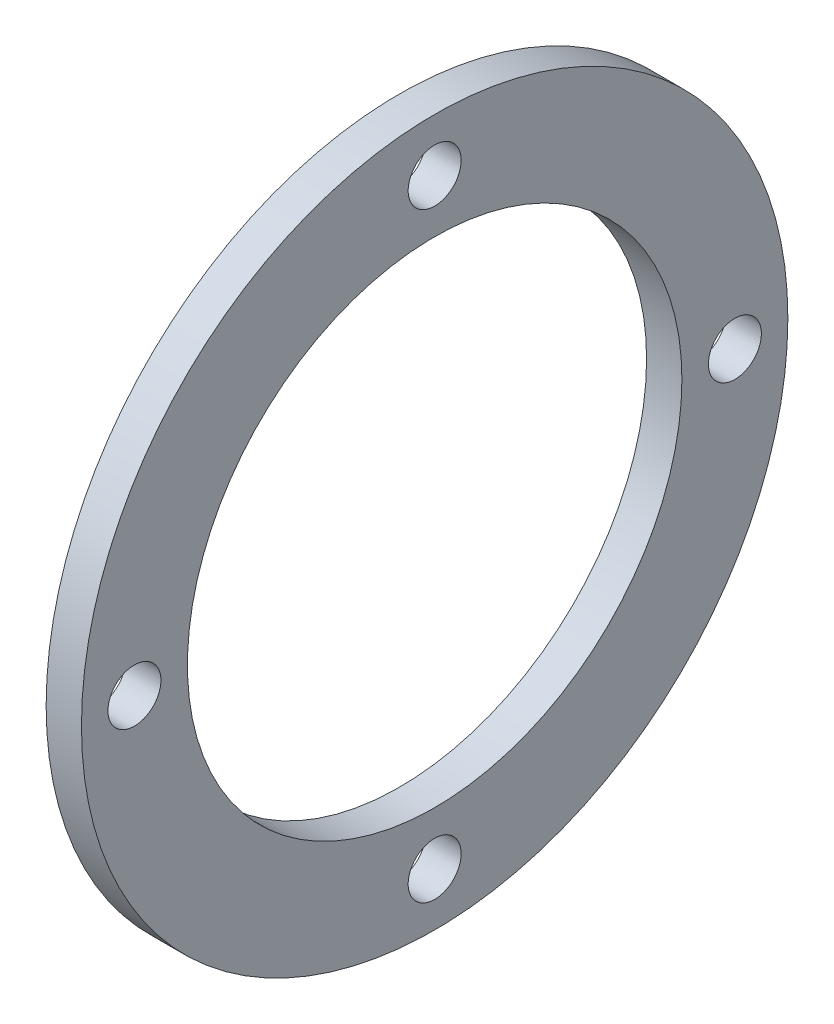
ISO-10303-21;
HEADER;
FILE_DESCRIPTION(('STEP AP214'),'2;1');
FILE_NAME('part.step','',(''),(''),'','','');
FILE_SCHEMA(('AUTOMOTIVE_DESIGN { 1 0 10303 214 1 1 1 1 }'));
ENDSEC;
DATA;
#1=APPLICATION_CONTEXT('core data for automotive mechanical design processes');
#2=APPLICATION_PROTOCOL_DEFINITION('international standard','automotive_design',2000,#1);
#3=PRODUCT_CONTEXT('',#1,'mechanical');
#4=PRODUCT('Part','Part','',(#3));
#5=PRODUCT_RELATED_PRODUCT_CATEGORY('part','',(#4));
#6=PRODUCT_DEFINITION_FORMATION('','',#4);
#7=PRODUCT_DEFINITION_CONTEXT('part definition',#1,'design');
#8=PRODUCT_DEFINITION('design','',#6,#7);
#9=PRODUCT_DEFINITION_SHAPE('','',#8);
#10=(LENGTH_UNIT() NAMED_UNIT(*) SI_UNIT(.MILLI.,.METRE.));
#11=(NAMED_UNIT(*) PLANE_ANGLE_UNIT() SI_UNIT($,.RADIAN.));
#12=(NAMED_UNIT(*) SI_UNIT($,.STERADIAN.) SOLID_ANGLE_UNIT());
#13=UNCERTAINTY_MEASURE_WITH_UNIT(LENGTH_MEASURE(1.E-05),#10,'distance_accuracy_value','');
#14=(GEOMETRIC_REPRESENTATION_CONTEXT(3) GLOBAL_UNCERTAINTY_ASSIGNED_CONTEXT((#13)) GLOBAL_UNIT_ASSIGNED_CONTEXT((#10,
#11,#12)) REPRESENTATION_CONTEXT('',''));
#15=CARTESIAN_POINT('',(0.,0.,0.));
#16=DIRECTION('',(0.,0.,1.));
#17=DIRECTION('',(1.,0.,0.));
#18=AXIS2_PLACEMENT_3D('',#15,#16,#17);
#19=CARTESIAN_POINT('',(2.,0.,0.));
#20=DIRECTION('',(1.,0.,0.));
#21=DIRECTION('',(0.,0.,-1.));
#22=AXIS2_PLACEMENT_3D('',#19,#20,#21);
#23=PLANE('',#22);
#24=CARTESIAN_POINT('',(2.,-17.,0.));
#25=DIRECTION('',(1.,0.,0.));
#26=DIRECTION('',(0.,0.,-1.));
#27=AXIS2_PLACEMENT_3D('',#24,#25,#26);
#28=CIRCLE('',#27,1.5);
#29=CARTESIAN_POINT('',(2.,-17.,-1.5));
#30=VERTEX_POINT('',#29);
#31=EDGE_CURVE('E78',#30,#30,#28,.T.);
#32=ORIENTED_EDGE('',*,*,#31,.F.);
#33=EDGE_LOOP('',(#32));
#34=FACE_BOUND('',#33,.T.);
#35=CARTESIAN_POINT('',(2.,17.,0.));
#36=DIRECTION('',(1.,0.,0.));
#37=DIRECTION('',(0.,0.,-1.));
#38=AXIS2_PLACEMENT_3D('',#35,#36,#37);
#39=CIRCLE('',#38,1.5);
#40=CARTESIAN_POINT('',(2.,17.,-1.5));
#41=VERTEX_POINT('',#40);
#42=EDGE_CURVE('E62',#41,#41,#39,.T.);
#43=ORIENTED_EDGE('',*,*,#42,.F.);
#44=EDGE_LOOP('',(#43));
#45=FACE_BOUND('',#44,.T.);
#46=CARTESIAN_POINT('',(2.,0.,0.));
#47=DIRECTION('',(1.,0.,0.));
#48=DIRECTION('',(0.,0.,-1.));
#49=AXIS2_PLACEMENT_3D('',#46,#47,#48);
#50=CIRCLE('',#49,20.);
#51=CARTESIAN_POINT('',(2.,0.,-20.));
#52=VERTEX_POINT('',#51);
#53=EDGE_CURVE('E10',#52,#52,#50,.T.);
#54=ORIENTED_EDGE('',*,*,#53,.T.);
#55=EDGE_LOOP('',(#54));
#56=FACE_BOUND('',#55,.T.);
#57=CARTESIAN_POINT('',(2.,0.,0.));
#58=DIRECTION('',(1.,0.,0.));
#59=DIRECTION('',(0.,0.,-1.));
#60=AXIS2_PLACEMENT_3D('',#57,#58,#59);
#61=CIRCLE('',#60,14.);
#62=CARTESIAN_POINT('',(2.,0.,-14.));
#63=VERTEX_POINT('',#62);
#64=EDGE_CURVE('E56',#63,#63,#61,.T.);
#65=ORIENTED_EDGE('',*,*,#64,.F.);
#66=EDGE_LOOP('',(#65));
#67=FACE_BOUND('',#66,.T.);
#68=CARTESIAN_POINT('',(2.,0.,-17.));
#69=DIRECTION('',(1.,0.,0.));
#70=DIRECTION('',(0.,0.,-1.));
#71=AXIS2_PLACEMENT_3D('',#68,#69,#70);
#72=CIRCLE('',#71,1.5);
#73=CARTESIAN_POINT('',(2.,0.,-18.5));
#74=VERTEX_POINT('',#73);
#75=EDGE_CURVE('E70',#74,#74,#72,.T.);
#76=ORIENTED_EDGE('',*,*,#75,.F.);
#77=EDGE_LOOP('',(#76));
#78=FACE_BOUND('',#77,.T.);
#79=CARTESIAN_POINT('',(2.,0.,17.));
#80=DIRECTION('',(1.,0.,0.));
#81=DIRECTION('',(0.,0.,-1.));
#82=AXIS2_PLACEMENT_3D('',#79,#80,#81);
#83=CIRCLE('',#82,1.5);
#84=CARTESIAN_POINT('',(2.,0.,15.5));
#85=VERTEX_POINT('',#84);
#86=EDGE_CURVE('E86',#85,#85,#83,.T.);
#87=ORIENTED_EDGE('',*,*,#86,.F.);
#88=EDGE_LOOP('',(#87));
#89=FACE_BOUND('',#88,.T.);
#90=ADVANCED_FACE('F43',(#34,#45,#56,#67,#78,#89),#23,.T.);
#91=CARTESIAN_POINT('',(0.,0.,0.));
#92=DIRECTION('',(1.,0.,0.));
#93=DIRECTION('',(0.,0.,-1.));
#94=AXIS2_PLACEMENT_3D('',#91,#92,#93);
#95=PLANE('',#94);
#96=CARTESIAN_POINT('',(0.,0.,0.));
#97=DIRECTION('',(1.,0.,0.));
#98=DIRECTION('',(0.,0.,-1.));
#99=AXIS2_PLACEMENT_3D('',#96,#97,#98);
#100=CIRCLE('',#99,20.);
#101=CARTESIAN_POINT('',(0.,0.,-20.));
#102=VERTEX_POINT('',#101);
#103=EDGE_CURVE('E47',#102,#102,#100,.T.);
#104=ORIENTED_EDGE('',*,*,#103,.F.);
#105=EDGE_LOOP('',(#104));
#106=FACE_BOUND('',#105,.T.);
#107=CARTESIAN_POINT('',(0.,0.,0.));
#108=DIRECTION('',(1.,0.,0.));
#109=DIRECTION('',(0.,0.,-1.));
#110=AXIS2_PLACEMENT_3D('',#107,#108,#109);
#111=CIRCLE('',#110,14.);
#112=CARTESIAN_POINT('',(0.,0.,-14.));
#113=VERTEX_POINT('',#112);
#114=EDGE_CURVE('E58',#113,#113,#111,.T.);
#115=ORIENTED_EDGE('',*,*,#114,.T.);
#116=EDGE_LOOP('',(#115));
#117=FACE_BOUND('',#116,.T.);
#118=CARTESIAN_POINT('',(0.,17.,0.));
#119=DIRECTION('',(1.,0.,0.));
#120=DIRECTION('',(0.,0.,-1.));
#121=AXIS2_PLACEMENT_3D('',#118,#119,#120);
#122=CIRCLE('',#121,1.5);
#123=CARTESIAN_POINT('',(0.,17.,-1.5));
#124=VERTEX_POINT('',#123);
#125=EDGE_CURVE('E66',#124,#124,#122,.T.);
#126=ORIENTED_EDGE('',*,*,#125,.T.);
#127=EDGE_LOOP('',(#126));
#128=FACE_BOUND('',#127,.T.);
#129=CARTESIAN_POINT('',(0.,0.,-17.));
#130=DIRECTION('',(1.,0.,0.));
#131=DIRECTION('',(0.,0.,-1.));
#132=AXIS2_PLACEMENT_3D('',#129,#130,#131);
#133=CIRCLE('',#132,1.5);
#134=CARTESIAN_POINT('',(0.,0.,-18.5));
#135=VERTEX_POINT('',#134);
#136=EDGE_CURVE('E74',#135,#135,#133,.T.);
#137=ORIENTED_EDGE('',*,*,#136,.T.);
#138=EDGE_LOOP('',(#137));
#139=FACE_BOUND('',#138,.T.);
#140=CARTESIAN_POINT('',(0.,-17.,0.));
#141=DIRECTION('',(1.,0.,0.));
#142=DIRECTION('',(0.,0.,-1.));
#143=AXIS2_PLACEMENT_3D('',#140,#141,#142);
#144=CIRCLE('',#143,1.5);
#145=CARTESIAN_POINT('',(0.,-17.,-1.5));
#146=VERTEX_POINT('',#145);
#147=EDGE_CURVE('E82',#146,#146,#144,.T.);
#148=ORIENTED_EDGE('',*,*,#147,.T.);
#149=EDGE_LOOP('',(#148));
#150=FACE_BOUND('',#149,.T.);
#151=CARTESIAN_POINT('',(0.,0.,17.));
#152=DIRECTION('',(1.,0.,0.));
#153=DIRECTION('',(0.,0.,-1.));
#154=AXIS2_PLACEMENT_3D('',#151,#152,#153);
#155=CIRCLE('',#154,1.5);
#156=CARTESIAN_POINT('',(0.,0.,15.5));
#157=VERTEX_POINT('',#156);
#158=EDGE_CURVE('E90',#157,#157,#155,.T.);
#159=ORIENTED_EDGE('',*,*,#158,.T.);
#160=EDGE_LOOP('',(#159));
#161=FACE_BOUND('',#160,.T.);
#162=ADVANCED_FACE('F102',(#106,#117,#128,#139,#150,#161),#95,.F.);
#163=CARTESIAN_POINT('',(2.,0.,0.));
#164=DIRECTION('',(-1.,0.,0.));
#165=DIRECTION('',(0.,0.,1.));
#166=AXIS2_PLACEMENT_3D('',#163,#164,#165);
#167=CYLINDRICAL_SURFACE('',#166,20.);
#168=ORIENTED_EDGE('',*,*,#53,.F.);
#169=EDGE_LOOP('',(#168));
#170=FACE_BOUND('',#169,.T.);
#171=ORIENTED_EDGE('',*,*,#103,.T.);
#172=EDGE_LOOP('',(#171));
#173=FACE_BOUND('',#172,.T.);
#174=ADVANCED_FACE('F45',(#170,#173),#167,.T.);
#175=CARTESIAN_POINT('',(2.,0.,0.));
#176=DIRECTION('',(-1.,0.,0.));
#177=DIRECTION('',(0.,0.,1.));
#178=AXIS2_PLACEMENT_3D('',#175,#176,#177);
#179=CYLINDRICAL_SURFACE('',#178,14.);
#180=ORIENTED_EDGE('',*,*,#64,.T.);
#181=EDGE_LOOP('',(#180));
#182=FACE_BOUND('',#181,.T.);
#183=ORIENTED_EDGE('',*,*,#114,.F.);
#184=EDGE_LOOP('',(#183));
#185=FACE_BOUND('',#184,.T.);
#186=ADVANCED_FACE('F112',(#182,#185),#179,.F.);
#187=CARTESIAN_POINT('',(2.,17.,0.));
#188=DIRECTION('',(-1.,0.,0.));
#189=DIRECTION('',(0.,0.,1.));
#190=AXIS2_PLACEMENT_3D('',#187,#188,#189);
#191=CYLINDRICAL_SURFACE('',#190,1.5);
#192=ORIENTED_EDGE('',*,*,#42,.T.);
#193=EDGE_LOOP('',(#192));
#194=FACE_BOUND('',#193,.T.);
#195=ORIENTED_EDGE('',*,*,#125,.F.);
#196=EDGE_LOOP('',(#195));
#197=FACE_BOUND('',#196,.T.);
#198=ADVANCED_FACE('F115',(#194,#197),#191,.F.);
#199=CARTESIAN_POINT('',(2.,0.,-17.));
#200=DIRECTION('',(-1.,0.,0.));
#201=DIRECTION('',(0.,0.,1.));
#202=AXIS2_PLACEMENT_3D('',#199,#200,#201);
#203=CYLINDRICAL_SURFACE('',#202,1.5);
#204=ORIENTED_EDGE('',*,*,#75,.T.);
#205=EDGE_LOOP('',(#204));
#206=FACE_BOUND('',#205,.T.);
#207=ORIENTED_EDGE('',*,*,#136,.F.);
#208=EDGE_LOOP('',(#207));
#209=FACE_BOUND('',#208,.T.);
#210=ADVANCED_FACE('F119',(#206,#209),#203,.F.);
#211=CARTESIAN_POINT('',(2.,-17.,0.));
#212=DIRECTION('',(-1.,0.,0.));
#213=DIRECTION('',(0.,0.,1.));
#214=AXIS2_PLACEMENT_3D('',#211,#212,#213);
#215=CYLINDRICAL_SURFACE('',#214,1.5);
#216=ORIENTED_EDGE('',*,*,#31,.T.);
#217=EDGE_LOOP('',(#216));
#218=FACE_BOUND('',#217,.T.);
#219=ORIENTED_EDGE('',*,*,#147,.F.);
#220=EDGE_LOOP('',(#219));
#221=FACE_BOUND('',#220,.T.);
#222=ADVANCED_FACE('F123',(#218,#221),#215,.F.);
#223=CARTESIAN_POINT('',(2.,0.,17.));
#224=DIRECTION('',(-1.,0.,0.));
#225=DIRECTION('',(0.,0.,1.));
#226=AXIS2_PLACEMENT_3D('',#223,#224,#225);
#227=CYLINDRICAL_SURFACE('',#226,1.5);
#228=ORIENTED_EDGE('',*,*,#86,.T.);
#229=EDGE_LOOP('',(#228));
#230=FACE_BOUND('',#229,.T.);
#231=ORIENTED_EDGE('',*,*,#158,.F.);
#232=EDGE_LOOP('',(#231));
#233=FACE_BOUND('',#232,.T.);
#234=ADVANCED_FACE('F98',(#230,#233),#227,.F.);
#235=CLOSED_SHELL('',(#90,#162,#174,#186,#198,#210,#222,#234));
#236=MANIFOLD_SOLID_BREP('B2',#235);
#237=ADVANCED_BREP_SHAPE_REPRESENTATION('',(#18,#236),#14);
#238=SHAPE_DEFINITION_REPRESENTATION(#9,#237);
ENDSEC;
END-ISO-10303-21;
